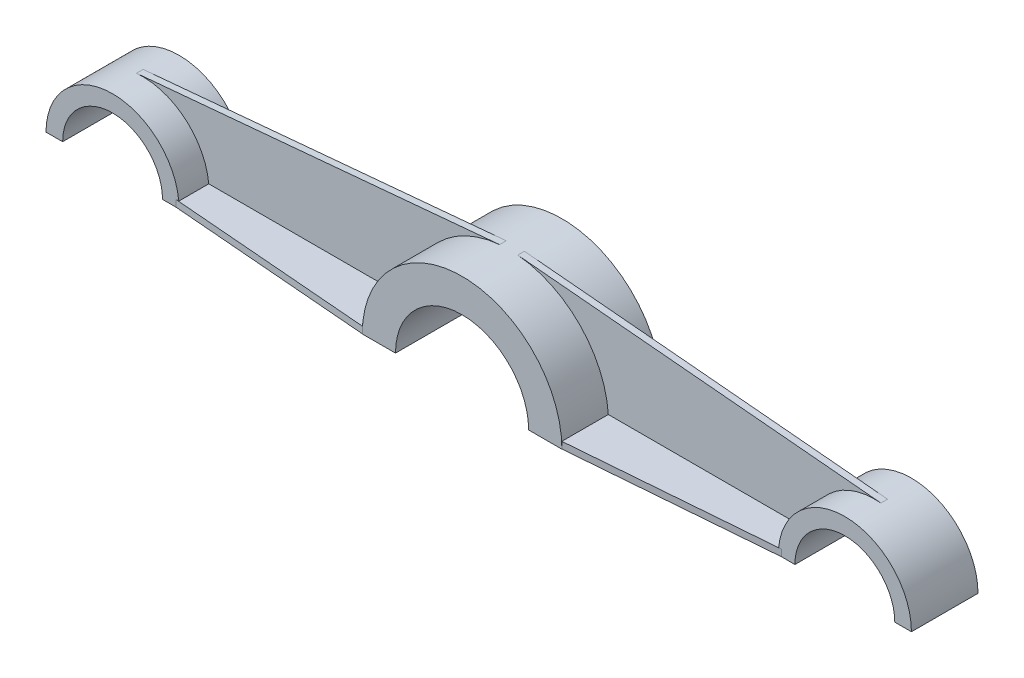
ISO-10303-21;
HEADER;
FILE_DESCRIPTION(('STEP AP214'),'2;1');
FILE_NAME('part.step','',(''),(''),'','','');
FILE_SCHEMA(('AUTOMOTIVE_DESIGN { 1 0 10303 214 1 1 1 1 }'));
ENDSEC;
DATA;
#1=APPLICATION_CONTEXT('core data for automotive mechanical design processes');
#2=APPLICATION_PROTOCOL_DEFINITION('international standard','automotive_design',2000,#1);
#3=PRODUCT_CONTEXT('',#1,'mechanical');
#4=PRODUCT('Part','Part','',(#3));
#5=PRODUCT_RELATED_PRODUCT_CATEGORY('part','',(#4));
#6=PRODUCT_DEFINITION_FORMATION('','',#4);
#7=PRODUCT_DEFINITION_CONTEXT('part definition',#1,'design');
#8=PRODUCT_DEFINITION('design','',#6,#7);
#9=PRODUCT_DEFINITION_SHAPE('','',#8);
#10=(LENGTH_UNIT() NAMED_UNIT(*) SI_UNIT(.MILLI.,.METRE.));
#11=(NAMED_UNIT(*) PLANE_ANGLE_UNIT() SI_UNIT($,.RADIAN.));
#12=(NAMED_UNIT(*) SI_UNIT($,.STERADIAN.) SOLID_ANGLE_UNIT());
#13=UNCERTAINTY_MEASURE_WITH_UNIT(LENGTH_MEASURE(1.E-05),#10,'distance_accuracy_value','');
#14=(GEOMETRIC_REPRESENTATION_CONTEXT(3) GLOBAL_UNCERTAINTY_ASSIGNED_CONTEXT((#13)) GLOBAL_UNIT_ASSIGNED_CONTEXT((#10,
#11,#12)) REPRESENTATION_CONTEXT('',''));
#15=CARTESIAN_POINT('',(0.,0.,0.));
#16=DIRECTION('',(0.,0.,1.));
#17=DIRECTION('',(1.,0.,0.));
#18=AXIS2_PLACEMENT_3D('',#15,#16,#17);
#19=CARTESIAN_POINT('',(0.,0.,15.));
#20=DIRECTION('',(0.,0.,-1.));
#21=DIRECTION('',(-1.,0.,0.));
#22=AXIS2_PLACEMENT_3D('',#19,#20,#21);
#23=CYLINDRICAL_SURFACE('',#22,30.);
#24=CARTESIAN_POINT('',(0.,0.,-17.3983739837398));
#25=DIRECTION('',(-0.0810334457587638,0.,0.996711382832794));
#26=DIRECTION('',(-0.996711382832794,0.,-0.0810334457587638));
#27=AXIS2_PLACEMENT_3D('',#24,#25,#26);
#28=ELLIPSE('',#27,30.098984035615,30.);
#29=CARTESIAN_POINT('',(30.,0.,-14.9593495934959));
#30=VERTEX_POINT('',#29);
#31=CARTESIAN_POINT('',(29.9332590941915,2.,-14.9647756833991));
#32=VERTEX_POINT('',#31);
#33=EDGE_CURVE('E245',#30,#32,#28,.T.);
#34=ORIENTED_EDGE('',*,*,#33,.F.);
#35=DIRECTION('',(0.,0.,-1.));
#36=VECTOR('',#35,1.);
#37=CARTESIAN_POINT('',(30.,0.,15.));
#38=LINE('',#37,#36);
#39=CARTESIAN_POINT('',(30.,0.,-15.));
#40=VERTEX_POINT('',#39);
#41=EDGE_CURVE('E502',#30,#40,#38,.T.);
#42=ORIENTED_EDGE('',*,*,#41,.T.);
#43=CARTESIAN_POINT('',(0.,0.,-15.));
#44=DIRECTION('',(0.,0.,1.));
#45=DIRECTION('',(1.,0.,0.));
#46=AXIS2_PLACEMENT_3D('',#43,#44,#45);
#47=CIRCLE('',#46,30.);
#48=CARTESIAN_POINT('',(-30.,0.,-15.));
#49=VERTEX_POINT('',#48);
#50=EDGE_CURVE('E481',#40,#49,#47,.T.);
#51=ORIENTED_EDGE('',*,*,#50,.T.);
#52=DIRECTION('',(0.,0.,-1.));
#53=VECTOR('',#52,1.);
#54=CARTESIAN_POINT('',(-30.,0.,15.));
#55=LINE('',#54,#53);
#56=CARTESIAN_POINT('',(-30.,0.,-14.9593495934959));
#57=VERTEX_POINT('',#56);
#58=EDGE_CURVE('E497',#57,#49,#55,.T.);
#59=ORIENTED_EDGE('',*,*,#58,.F.);
#60=CARTESIAN_POINT('',(0.,0.,-17.3983739837398));
#61=DIRECTION('',(0.0810334457587638,0.,0.996711382832794));
#62=DIRECTION('',(0.996711382832794,0.,-0.0810334457587638));
#63=AXIS2_PLACEMENT_3D('',#60,#61,#62);
#64=ELLIPSE('',#63,30.098984035615,30.);
#65=CARTESIAN_POINT('',(-29.9332590941915,2.,-14.9647756833991));
#66=VERTEX_POINT('',#65);
#67=EDGE_CURVE('E304',#66,#57,#64,.T.);
#68=ORIENTED_EDGE('',*,*,#67,.F.);
#69=DIRECTION('',(0.,0.,-1.));
#70=VECTOR('',#69,1.);
#71=CARTESIAN_POINT('',(-29.9332590941915,2.,15.));
#72=LINE('',#71,#70);
#73=CARTESIAN_POINT('',(-29.9332590941915,2.,-1.));
#74=VERTEX_POINT('',#73);
#75=EDGE_CURVE('E295',#74,#66,#72,.T.);
#76=ORIENTED_EDGE('',*,*,#75,.F.);
#77=CARTESIAN_POINT('',(0.,0.,-1.));
#78=DIRECTION('',(0.,0.,-1.));
#79=DIRECTION('',(1.,0.,0.));
#80=AXIS2_PLACEMENT_3D('',#77,#78,#79);
#81=CIRCLE('',#80,30.);
#82=CARTESIAN_POINT('',(-2.72727272727273,29.8757758639182,-1.));
#83=VERTEX_POINT('',#82);
#84=EDGE_CURVE('E385',#74,#83,#81,.T.);
#85=ORIENTED_EDGE('',*,*,#84,.T.);
#86=DIRECTION('',(0.,0.,-1.));
#87=VECTOR('',#86,1.);
#88=CARTESIAN_POINT('',(-2.72727272727273,29.8757758639182,1.));
#89=LINE('',#88,#87);
#90=CARTESIAN_POINT('',(-2.72727272727273,29.8757758639182,1.));
#91=VERTEX_POINT('',#90);
#92=EDGE_CURVE('E368',#91,#83,#89,.T.);
#93=ORIENTED_EDGE('',*,*,#92,.F.);
#94=CARTESIAN_POINT('',(0.,0.,1.));
#95=DIRECTION('',(0.,0.,-1.));
#96=DIRECTION('',(1.,0.,0.));
#97=AXIS2_PLACEMENT_3D('',#94,#95,#96);
#98=CIRCLE('',#97,30.);
#99=CARTESIAN_POINT('',(-29.9332590941915,2.,1.));
#100=VERTEX_POINT('',#99);
#101=EDGE_CURVE('E382',#100,#91,#98,.T.);
#102=ORIENTED_EDGE('',*,*,#101,.F.);
#103=CARTESIAN_POINT('',(-29.9332590941915,2.,14.9647756833991));
#104=VERTEX_POINT('',#103);
#105=EDGE_CURVE('E68',#104,#100,#72,.T.);
#106=ORIENTED_EDGE('',*,*,#105,.F.);
#107=CARTESIAN_POINT('',(0.,0.,17.3983739837398));
#108=DIRECTION('',(0.0810334457587638,0.,-0.996711382832794));
#109=DIRECTION('',(-0.996711382832794,0.,-0.0810334457587638));
#110=AXIS2_PLACEMENT_3D('',#107,#108,#109);
#111=ELLIPSE('',#110,30.098984035615,30.);
#112=CARTESIAN_POINT('',(-30.,0.,14.9593495934959));
#113=VERTEX_POINT('',#112);
#114=EDGE_CURVE('E307',#113,#104,#111,.T.);
#115=ORIENTED_EDGE('',*,*,#114,.F.);
#116=CARTESIAN_POINT('',(-30.,0.,15.));
#117=VERTEX_POINT('',#116);
#118=EDGE_CURVE('E498',#117,#113,#55,.T.);
#119=ORIENTED_EDGE('',*,*,#118,.F.);
#120=CARTESIAN_POINT('',(0.,0.,15.));
#121=DIRECTION('',(0.,0.,1.));
#122=DIRECTION('',(1.,0.,0.));
#123=AXIS2_PLACEMENT_3D('',#120,#121,#122);
#124=CIRCLE('',#123,30.);
#125=CARTESIAN_POINT('',(30.,0.,15.));
#126=VERTEX_POINT('',#125);
#127=EDGE_CURVE('E467',#126,#117,#124,.T.);
#128=ORIENTED_EDGE('',*,*,#127,.F.);
#129=CARTESIAN_POINT('',(30.,0.,14.9593495934959));
#130=VERTEX_POINT('',#129);
#131=EDGE_CURVE('E503',#126,#130,#38,.T.);
#132=ORIENTED_EDGE('',*,*,#131,.T.);
#133=CARTESIAN_POINT('',(0.,0.,17.3983739837398));
#134=DIRECTION('',(-0.0810334457587638,0.,-0.996711382832794));
#135=DIRECTION('',(0.996711382832794,0.,-0.0810334457587638));
#136=AXIS2_PLACEMENT_3D('',#133,#134,#135);
#137=ELLIPSE('',#136,30.098984035615,30.);
#138=CARTESIAN_POINT('',(29.9332590941915,2.,14.9647756833991));
#139=VERTEX_POINT('',#138);
#140=EDGE_CURVE('E61',#139,#130,#137,.T.);
#141=ORIENTED_EDGE('',*,*,#140,.F.);
#142=DIRECTION('',(0.,0.,-1.));
#143=VECTOR('',#142,1.);
#144=CARTESIAN_POINT('',(29.9332590941915,2.,15.));
#145=LINE('',#144,#143);
#146=CARTESIAN_POINT('',(29.9332590941915,2.,1.));
#147=VERTEX_POINT('',#146);
#148=EDGE_CURVE('E320',#147,#139,#145,.F.);
#149=ORIENTED_EDGE('',*,*,#148,.F.);
#150=CARTESIAN_POINT('',(0.,0.,1.));
#151=DIRECTION('',(0.,0.,-1.));
#152=DIRECTION('',(1.,0.,0.));
#153=AXIS2_PLACEMENT_3D('',#150,#151,#152);
#154=CIRCLE('',#153,30.);
#155=CARTESIAN_POINT('',(2.72727272727272,29.8757758639181,1.));
#156=VERTEX_POINT('',#155);
#157=EDGE_CURVE('E443',#156,#147,#154,.T.);
#158=ORIENTED_EDGE('',*,*,#157,.F.);
#159=DIRECTION('',(0.,0.,-1.));
#160=VECTOR('',#159,1.);
#161=CARTESIAN_POINT('',(2.72727272727273,29.8757758639181,1.));
#162=LINE('',#161,#160);
#163=CARTESIAN_POINT('',(2.72727272727273,29.8757758639181,-1.));
#164=VERTEX_POINT('',#163);
#165=EDGE_CURVE('E447',#156,#164,#162,.T.);
#166=ORIENTED_EDGE('',*,*,#165,.T.);
#167=CARTESIAN_POINT('',(0.,0.,-1.));
#168=DIRECTION('',(0.,0.,-1.));
#169=DIRECTION('',(1.,0.,0.));
#170=AXIS2_PLACEMENT_3D('',#167,#168,#169);
#171=CIRCLE('',#170,30.);
#172=CARTESIAN_POINT('',(29.9332590941915,2.,-1.));
#173=VERTEX_POINT('',#172);
#174=EDGE_CURVE('E439',#164,#173,#171,.T.);
#175=ORIENTED_EDGE('',*,*,#174,.T.);
#176=EDGE_CURVE('E316',#32,#173,#145,.F.);
#177=ORIENTED_EDGE('',*,*,#176,.F.);
#178=EDGE_LOOP('',(#34,#42,#51,#59,#68,#76,#85,#93,#102,#106,#115,#119,#128,#132,#141,#149,#158,
#166,#175,#177));
#179=FACE_BOUND('',#178,.T.);
#180=ADVANCED_FACE('F45',(#179),#23,.T.);
#181=CARTESIAN_POINT('',(110.,0.,1.));
#182=DIRECTION('',(0.,0.,1.));
#183=DIRECTION('',(1.,0.,0.));
#184=AXIS2_PLACEMENT_3D('',#181,#182,#183);
#185=PLANE('',#184);
#186=ORIENTED_EDGE('',*,*,#157,.T.);
#187=DIRECTION('',(1.,0.,0.));
#188=VECTOR('',#187,1.);
#189=CARTESIAN_POINT('',(110.,2.,1.));
#190=LINE('',#189,#188);
#191=CARTESIAN_POINT('',(90.1002512578676,2.,1.));
#192=VERTEX_POINT('',#191);
#193=EDGE_CURVE('E323',#147,#192,#190,.T.);
#194=ORIENTED_EDGE('',*,*,#193,.T.);
#195=CARTESIAN_POINT('',(110.,0.,1.));
#196=DIRECTION('',(0.,0.,-1.));
#197=DIRECTION('',(1.,0.,0.));
#198=AXIS2_PLACEMENT_3D('',#195,#196,#197);
#199=CIRCLE('',#198,20.);
#200=CARTESIAN_POINT('',(111.818181818182,19.9171839092788,1.));
#201=VERTEX_POINT('',#200);
#202=EDGE_CURVE('E435',#192,#201,#199,.T.);
#203=ORIENTED_EDGE('',*,*,#202,.T.);
#204=DIRECTION('',(-0.995859195463939,0.0909090909090908,0.));
#205=VECTOR('',#204,1.);
#206=CARTESIAN_POINT('',(2.72727272727272,29.8757758639181,1.));
#207=LINE('',#206,#205);
#208=EDGE_CURVE('E438',#201,#156,#207,.T.);
#209=ORIENTED_EDGE('',*,*,#208,.T.);
#210=EDGE_LOOP('',(#186,#194,#203,#209));
#211=FACE_BOUND('',#210,.T.);
#212=ADVANCED_FACE('F586',(#211),#185,.T.);
#213=CARTESIAN_POINT('',(110.,0.,-1.));
#214=DIRECTION('',(0.,0.,1.));
#215=DIRECTION('',(1.,0.,0.));
#216=AXIS2_PLACEMENT_3D('',#213,#214,#215);
#217=PLANE('',#216);
#218=DIRECTION('',(1.,0.,0.));
#219=VECTOR('',#218,1.);
#220=CARTESIAN_POINT('',(110.,2.,-1.));
#221=LINE('',#220,#219);
#222=CARTESIAN_POINT('',(90.1002512578676,2.,-0.999999999999999));
#223=VERTEX_POINT('',#222);
#224=EDGE_CURVE('E312',#173,#223,#221,.T.);
#225=ORIENTED_EDGE('',*,*,#224,.F.);
#226=ORIENTED_EDGE('',*,*,#174,.F.);
#227=DIRECTION('',(-0.995859195463939,0.0909090909090908,0.));
#228=VECTOR('',#227,1.);
#229=CARTESIAN_POINT('',(2.72727272727272,29.8757758639181,-1.));
#230=LINE('',#229,#228);
#231=CARTESIAN_POINT('',(111.818181818182,19.9171839092788,-0.999999999999999));
#232=VERTEX_POINT('',#231);
#233=EDGE_CURVE('E450',#232,#164,#230,.T.);
#234=ORIENTED_EDGE('',*,*,#233,.F.);
#235=CARTESIAN_POINT('',(110.,0.,-1.));
#236=DIRECTION('',(0.,0.,-1.));
#237=DIRECTION('',(1.,0.,0.));
#238=AXIS2_PLACEMENT_3D('',#235,#236,#237);
#239=CIRCLE('',#238,20.);
#240=EDGE_CURVE('E421',#223,#232,#239,.T.);
#241=ORIENTED_EDGE('',*,*,#240,.F.);
#242=EDGE_LOOP('',(#225,#226,#234,#241));
#243=FACE_BOUND('',#242,.T.);
#244=ADVANCED_FACE('F590',(#243),#217,.F.);
#245=CARTESIAN_POINT('',(110.,0.,10.));
#246=DIRECTION('',(0.,0.,-1.));
#247=DIRECTION('',(-1.,0.,0.));
#248=AXIS2_PLACEMENT_3D('',#245,#246,#247);
#249=CYLINDRICAL_SURFACE('',#248,20.);
#250=DIRECTION('',(0.,0.,-1.));
#251=VECTOR('',#250,1.);
#252=CARTESIAN_POINT('',(90.1002512578676,2.,10.));
#253=LINE('',#252,#251);
#254=CARTESIAN_POINT('',(90.1002512578676,2.,10.));
#255=VERTEX_POINT('',#254);
#256=EDGE_CURVE('E313',#255,#192,#253,.T.);
#257=ORIENTED_EDGE('',*,*,#256,.F.);
#258=CARTESIAN_POINT('',(110.,0.,10.));
#259=DIRECTION('',(0.,0.,1.));
#260=DIRECTION('',(1.,0.,0.));
#261=AXIS2_PLACEMENT_3D('',#258,#259,#260);
#262=CIRCLE('',#261,20.);
#263=CARTESIAN_POINT('',(130.,0.,10.));
#264=VERTEX_POINT('',#263);
#265=EDGE_CURVE('E428',#264,#255,#262,.T.);
#266=ORIENTED_EDGE('',*,*,#265,.F.);
#267=DIRECTION('',(0.,0.,-1.));
#268=VECTOR('',#267,1.);
#269=CARTESIAN_POINT('',(130.,0.,10.));
#270=LINE('',#269,#268);
#271=CARTESIAN_POINT('',(130.,0.,-10.));
#272=VERTEX_POINT('',#271);
#273=EDGE_CURVE('E388',#264,#272,#270,.T.);
#274=ORIENTED_EDGE('',*,*,#273,.T.);
#275=CARTESIAN_POINT('',(110.,0.,-10.));
#276=DIRECTION('',(0.,0.,1.));
#277=DIRECTION('',(1.,0.,0.));
#278=AXIS2_PLACEMENT_3D('',#275,#276,#277);
#279=CIRCLE('',#278,20.);
#280=CARTESIAN_POINT('',(90.1002512578676,2.,-10.));
#281=VERTEX_POINT('',#280);
#282=EDGE_CURVE('E414',#272,#281,#279,.T.);
#283=ORIENTED_EDGE('',*,*,#282,.T.);
#284=EDGE_CURVE('E235',#223,#281,#253,.T.);
#285=ORIENTED_EDGE('',*,*,#284,.F.);
#286=ORIENTED_EDGE('',*,*,#240,.T.);
#287=DIRECTION('',(0.,0.,-1.));
#288=VECTOR('',#287,1.);
#289=CARTESIAN_POINT('',(111.818181818182,19.9171839092788,1.));
#290=LINE('',#289,#288);
#291=EDGE_CURVE('E459',#201,#232,#290,.T.);
#292=ORIENTED_EDGE('',*,*,#291,.F.);
#293=ORIENTED_EDGE('',*,*,#202,.F.);
#294=EDGE_LOOP('',(#257,#266,#274,#283,#285,#286,#292,#293));
#295=FACE_BOUND('',#294,.T.);
#296=ADVANCED_FACE('F608',(#295),#249,.T.);
#297=CARTESIAN_POINT('',(110.,0.,10.));
#298=DIRECTION('',(0.,0.,1.));
#299=DIRECTION('',(1.,0.,0.));
#300=AXIS2_PLACEMENT_3D('',#297,#298,#299);
#301=PLANE('',#300);
#302=DIRECTION('',(1.,0.,0.));
#303=VECTOR('',#302,1.);
#304=CARTESIAN_POINT('',(110.,2.,10.));
#305=LINE('',#304,#303);
#306=CARTESIAN_POINT('',(91.,2.,10.));
#307=VERTEX_POINT('',#306);
#308=EDGE_CURVE('E319',#255,#307,#305,.T.);
#309=ORIENTED_EDGE('',*,*,#308,.T.);
#310=DIRECTION('',(0.,-1.,0.));
#311=VECTOR('',#310,1.);
#312=CARTESIAN_POINT('',(91.,2.,10.));
#313=LINE('',#312,#311);
#314=CARTESIAN_POINT('',(91.,0.,10.));
#315=VERTEX_POINT('',#314);
#316=EDGE_CURVE('E254',#307,#315,#313,.T.);
#317=ORIENTED_EDGE('',*,*,#316,.T.);
#318=DIRECTION('',(1.,0.,0.));
#319=VECTOR('',#318,1.);
#320=CARTESIAN_POINT('',(90.,0.,10.));
#321=LINE('',#320,#319);
#322=CARTESIAN_POINT('',(95.,0.,10.));
#323=VERTEX_POINT('',#322);
#324=EDGE_CURVE('E425',#315,#323,#321,.T.);
#325=ORIENTED_EDGE('',*,*,#324,.T.);
#326=CARTESIAN_POINT('',(110.,0.,10.));
#327=DIRECTION('',(0.,0.,1.));
#328=DIRECTION('',(1.,0.,0.));
#329=AXIS2_PLACEMENT_3D('',#326,#327,#328);
#330=CIRCLE('',#329,15.);
#331=CARTESIAN_POINT('',(125.,0.,10.));
#332=VERTEX_POINT('',#331);
#333=EDGE_CURVE('E407',#332,#323,#330,.T.);
#334=ORIENTED_EDGE('',*,*,#333,.F.);
#335=DIRECTION('',(1.,0.,0.));
#336=VECTOR('',#335,1.);
#337=CARTESIAN_POINT('',(125.,0.,10.));
#338=LINE('',#337,#336);
#339=EDGE_CURVE('E411',#332,#264,#338,.T.);
#340=ORIENTED_EDGE('',*,*,#339,.T.);
#341=ORIENTED_EDGE('',*,*,#265,.T.);
#342=EDGE_LOOP('',(#309,#317,#325,#334,#340,#341));
#343=FACE_BOUND('',#342,.T.);
#344=ADVANCED_FACE('F611',(#343),#301,.T.);
#345=CARTESIAN_POINT('',(110.,0.,-10.));
#346=DIRECTION('',(0.,0.,1.));
#347=DIRECTION('',(1.,0.,0.));
#348=AXIS2_PLACEMENT_3D('',#345,#346,#347);
#349=PLANE('',#348);
#350=DIRECTION('',(0.,-1.,0.));
#351=VECTOR('',#350,1.);
#352=CARTESIAN_POINT('',(91.,2.,-10.));
#353=LINE('',#352,#351);
#354=CARTESIAN_POINT('',(91.,2.,-10.));
#355=VERTEX_POINT('',#354);
#356=CARTESIAN_POINT('',(91.,0.,-10.));
#357=VERTEX_POINT('',#356);
#358=EDGE_CURVE('E242',#355,#357,#353,.T.);
#359=ORIENTED_EDGE('',*,*,#358,.F.);
#360=DIRECTION('',(1.,0.,0.));
#361=VECTOR('',#360,1.);
#362=CARTESIAN_POINT('',(110.,2.,-10.));
#363=LINE('',#362,#361);
#364=EDGE_CURVE('E11',#281,#355,#363,.T.);
#365=ORIENTED_EDGE('',*,*,#364,.F.);
#366=ORIENTED_EDGE('',*,*,#282,.F.);
#367=DIRECTION('',(1.,0.,0.));
#368=VECTOR('',#367,1.);
#369=CARTESIAN_POINT('',(125.,0.,-10.));
#370=LINE('',#369,#368);
#371=CARTESIAN_POINT('',(125.,0.,-10.));
#372=VERTEX_POINT('',#371);
#373=EDGE_CURVE('E417',#372,#272,#370,.T.);
#374=ORIENTED_EDGE('',*,*,#373,.F.);
#375=CARTESIAN_POINT('',(110.,0.,-10.));
#376=DIRECTION('',(0.,0.,1.));
#377=DIRECTION('',(1.,0.,0.));
#378=AXIS2_PLACEMENT_3D('',#375,#376,#377);
#379=CIRCLE('',#378,15.);
#380=CARTESIAN_POINT('',(95.,0.,-10.));
#381=VERTEX_POINT('',#380);
#382=EDGE_CURVE('E408',#372,#381,#379,.T.);
#383=ORIENTED_EDGE('',*,*,#382,.T.);
#384=DIRECTION('',(1.,0.,0.));
#385=VECTOR('',#384,1.);
#386=CARTESIAN_POINT('',(90.,0.,-10.));
#387=LINE('',#386,#385);
#388=EDGE_CURVE('E252',#357,#381,#387,.T.);
#389=ORIENTED_EDGE('',*,*,#388,.F.);
#390=EDGE_LOOP('',(#359,#365,#366,#374,#383,#389));
#391=FACE_BOUND('',#390,.T.);
#392=ADVANCED_FACE('F250',(#391),#349,.F.);
#393=CARTESIAN_POINT('',(0.,0.,1.));
#394=DIRECTION('',(0.,0.,1.));
#395=DIRECTION('',(1.,0.,0.));
#396=AXIS2_PLACEMENT_3D('',#393,#394,#395);
#397=PLANE('',#396);
#398=CARTESIAN_POINT('',(-110.,0.,1.));
#399=DIRECTION('',(0.,0.,-1.));
#400=DIRECTION('',(1.,0.,0.));
#401=AXIS2_PLACEMENT_3D('',#398,#399,#400);
#402=CIRCLE('',#401,20.);
#403=CARTESIAN_POINT('',(-111.818181818182,19.9171839092788,1.));
#404=VERTEX_POINT('',#403);
#405=CARTESIAN_POINT('',(-90.1002512578676,2.,1.));
#406=VERTEX_POINT('',#405);
#407=EDGE_CURVE('E376',#404,#406,#402,.T.);
#408=ORIENTED_EDGE('',*,*,#407,.T.);
#409=DIRECTION('',(1.,0.,0.));
#410=VECTOR('',#409,1.);
#411=CARTESIAN_POINT('',(0.,2.,1.));
#412=LINE('',#411,#410);
#413=EDGE_CURVE('E301',#406,#100,#412,.T.);
#414=ORIENTED_EDGE('',*,*,#413,.T.);
#415=ORIENTED_EDGE('',*,*,#101,.T.);
#416=DIRECTION('',(-0.995859195463939,-0.0909090909090909,0.));
#417=VECTOR('',#416,1.);
#418=CARTESIAN_POINT('',(-111.818181818182,19.9171839092788,1.));
#419=LINE('',#418,#417);
#420=EDGE_CURVE('E392',#91,#404,#419,.T.);
#421=ORIENTED_EDGE('',*,*,#420,.T.);
#422=EDGE_LOOP('',(#408,#414,#415,#421));
#423=FACE_BOUND('',#422,.T.);
#424=ADVANCED_FACE('F617',(#423),#397,.T.);
#425=CARTESIAN_POINT('',(0.,0.,-1.));
#426=DIRECTION('',(0.,0.,1.));
#427=DIRECTION('',(1.,0.,0.));
#428=AXIS2_PLACEMENT_3D('',#425,#426,#427);
#429=PLANE('',#428);
#430=DIRECTION('',(1.,0.,0.));
#431=VECTOR('',#430,1.);
#432=CARTESIAN_POINT('',(0.,2.,-1.));
#433=LINE('',#432,#431);
#434=CARTESIAN_POINT('',(-90.1002512578676,2.,-0.999999999999999));
#435=VERTEX_POINT('',#434);
#436=EDGE_CURVE('E291',#435,#74,#433,.T.);
#437=ORIENTED_EDGE('',*,*,#436,.F.);
#438=CARTESIAN_POINT('',(-110.,0.,-1.));
#439=DIRECTION('',(0.,0.,-1.));
#440=DIRECTION('',(1.,0.,0.));
#441=AXIS2_PLACEMENT_3D('',#438,#439,#440);
#442=CIRCLE('',#441,20.);
#443=CARTESIAN_POINT('',(-111.818181818182,19.9171839092788,-1.));
#444=VERTEX_POINT('',#443);
#445=EDGE_CURVE('E377',#444,#435,#442,.T.);
#446=ORIENTED_EDGE('',*,*,#445,.F.);
#447=DIRECTION('',(-0.995859195463939,-0.0909090909090909,0.));
#448=VECTOR('',#447,1.);
#449=CARTESIAN_POINT('',(-111.818181818182,19.9171839092788,-1.));
#450=LINE('',#449,#448);
#451=EDGE_CURVE('E381',#83,#444,#450,.T.);
#452=ORIENTED_EDGE('',*,*,#451,.F.);
#453=ORIENTED_EDGE('',*,*,#84,.F.);
#454=EDGE_LOOP('',(#437,#446,#452,#453));
#455=FACE_BOUND('',#454,.T.);
#456=ADVANCED_FACE('F630',(#455),#429,.F.);
#457=CARTESIAN_POINT('',(-110.,0.,10.));
#458=DIRECTION('',(0.,0.,-1.));
#459=DIRECTION('',(-1.,0.,0.));
#460=AXIS2_PLACEMENT_3D('',#457,#458,#459);
#461=CYLINDRICAL_SURFACE('',#460,20.);
#462=DIRECTION('',(0.,0.,-1.));
#463=VECTOR('',#462,1.);
#464=CARTESIAN_POINT('',(-90.1002512578676,2.,10.));
#465=LINE('',#464,#463);
#466=CARTESIAN_POINT('',(-90.1002512578676,2.,-10.));
#467=VERTEX_POINT('',#466);
#468=EDGE_CURVE('E259',#467,#435,#465,.F.);
#469=ORIENTED_EDGE('',*,*,#468,.F.);
#470=CARTESIAN_POINT('',(-110.,0.,-10.));
#471=DIRECTION('',(0.,0.,1.));
#472=DIRECTION('',(1.,0.,0.));
#473=AXIS2_PLACEMENT_3D('',#470,#471,#472);
#474=CIRCLE('',#473,20.);
#475=CARTESIAN_POINT('',(-130.,0.,-10.));
#476=VERTEX_POINT('',#475);
#477=EDGE_CURVE('E349',#467,#476,#474,.T.);
#478=ORIENTED_EDGE('',*,*,#477,.T.);
#479=DIRECTION('',(0.,0.,-1.));
#480=VECTOR('',#479,1.);
#481=CARTESIAN_POINT('',(-130.,0.,10.));
#482=LINE('',#481,#480);
#483=CARTESIAN_POINT('',(-130.,0.,10.));
#484=VERTEX_POINT('',#483);
#485=EDGE_CURVE('E364',#484,#476,#482,.T.);
#486=ORIENTED_EDGE('',*,*,#485,.F.);
#487=CARTESIAN_POINT('',(-110.,0.,10.));
#488=DIRECTION('',(0.,0.,1.));
#489=DIRECTION('',(1.,0.,0.));
#490=AXIS2_PLACEMENT_3D('',#487,#488,#489);
#491=CIRCLE('',#490,20.);
#492=CARTESIAN_POINT('',(-90.1002512578676,2.,10.));
#493=VERTEX_POINT('',#492);
#494=EDGE_CURVE('E334',#493,#484,#491,.T.);
#495=ORIENTED_EDGE('',*,*,#494,.F.);
#496=EDGE_CURVE('E292',#406,#493,#465,.F.);
#497=ORIENTED_EDGE('',*,*,#496,.F.);
#498=ORIENTED_EDGE('',*,*,#407,.F.);
#499=DIRECTION('',(0.,0.,-1.));
#500=VECTOR('',#499,1.);
#501=CARTESIAN_POINT('',(-111.818181818182,19.9171839092788,1.));
#502=LINE('',#501,#500);
#503=EDGE_CURVE('E372',#404,#444,#502,.T.);
#504=ORIENTED_EDGE('',*,*,#503,.T.);
#505=ORIENTED_EDGE('',*,*,#445,.T.);
#506=EDGE_LOOP('',(#469,#478,#486,#495,#497,#498,#504,#505));
#507=FACE_BOUND('',#506,.T.);
#508=ADVANCED_FACE('F516',(#507),#461,.T.);
#509=CARTESIAN_POINT('',(-110.,0.,10.));
#510=DIRECTION('',(0.,0.,1.));
#511=DIRECTION('',(1.,0.,0.));
#512=AXIS2_PLACEMENT_3D('',#509,#510,#511);
#513=PLANE('',#512);
#514=DIRECTION('',(1.,0.,0.));
#515=VECTOR('',#514,1.);
#516=CARTESIAN_POINT('',(-95.,0.,10.));
#517=LINE('',#516,#515);
#518=CARTESIAN_POINT('',(-95.,0.,10.));
#519=VERTEX_POINT('',#518);
#520=CARTESIAN_POINT('',(-91.,0.,10.));
#521=VERTEX_POINT('',#520);
#522=EDGE_CURVE('E331',#519,#521,#517,.T.);
#523=ORIENTED_EDGE('',*,*,#522,.T.);
#524=DIRECTION('',(0.,-1.,0.));
#525=VECTOR('',#524,1.);
#526=CARTESIAN_POINT('',(-91.,2.,10.));
#527=LINE('',#526,#525);
#528=CARTESIAN_POINT('',(-91.,2.,10.));
#529=VERTEX_POINT('',#528);
#530=EDGE_CURVE('E270',#529,#521,#527,.T.);
#531=ORIENTED_EDGE('',*,*,#530,.F.);
#532=DIRECTION('',(1.,0.,0.));
#533=VECTOR('',#532,1.);
#534=CARTESIAN_POINT('',(-110.,2.,10.));
#535=LINE('',#534,#533);
#536=EDGE_CURVE('E298',#529,#493,#535,.T.);
#537=ORIENTED_EDGE('',*,*,#536,.T.);
#538=ORIENTED_EDGE('',*,*,#494,.T.);
#539=DIRECTION('',(1.,0.,0.));
#540=VECTOR('',#539,1.);
#541=CARTESIAN_POINT('',(-130.,0.,10.));
#542=LINE('',#541,#540);
#543=CARTESIAN_POINT('',(-125.,0.,10.));
#544=VERTEX_POINT('',#543);
#545=EDGE_CURVE('E338',#484,#544,#542,.T.);
#546=ORIENTED_EDGE('',*,*,#545,.T.);
#547=CARTESIAN_POINT('',(-110.,0.,10.));
#548=DIRECTION('',(0.,0.,1.));
#549=DIRECTION('',(1.,0.,0.));
#550=AXIS2_PLACEMENT_3D('',#547,#548,#549);
#551=CIRCLE('',#550,15.);
#552=EDGE_CURVE('E341',#519,#544,#551,.T.);
#553=ORIENTED_EDGE('',*,*,#552,.F.);
#554=EDGE_LOOP('',(#523,#531,#537,#538,#546,#553));
#555=FACE_BOUND('',#554,.T.);
#556=ADVANCED_FACE('F570',(#555),#513,.T.);
#557=CARTESIAN_POINT('',(-110.,0.,-10.));
#558=DIRECTION('',(0.,0.,1.));
#559=DIRECTION('',(1.,0.,0.));
#560=AXIS2_PLACEMENT_3D('',#557,#558,#559);
#561=PLANE('',#560);
#562=DIRECTION('',(0.,-1.,0.));
#563=VECTOR('',#562,1.);
#564=CARTESIAN_POINT('',(-91.,2.,-10.));
#565=LINE('',#564,#563);
#566=CARTESIAN_POINT('',(-91.,2.,-10.));
#567=VERTEX_POINT('',#566);
#568=CARTESIAN_POINT('',(-91.,0.,-10.));
#569=VERTEX_POINT('',#568);
#570=EDGE_CURVE('E266',#567,#569,#565,.T.);
#571=ORIENTED_EDGE('',*,*,#570,.T.);
#572=DIRECTION('',(1.,0.,0.));
#573=VECTOR('',#572,1.);
#574=CARTESIAN_POINT('',(-95.,0.,-10.));
#575=LINE('',#574,#573);
#576=CARTESIAN_POINT('',(-95.,0.,-10.));
#577=VERTEX_POINT('',#576);
#578=EDGE_CURVE('E330',#577,#569,#575,.T.);
#579=ORIENTED_EDGE('',*,*,#578,.F.);
#580=CARTESIAN_POINT('',(-110.,0.,-10.));
#581=DIRECTION('',(0.,0.,1.));
#582=DIRECTION('',(1.,0.,0.));
#583=AXIS2_PLACEMENT_3D('',#580,#581,#582);
#584=CIRCLE('',#583,15.);
#585=CARTESIAN_POINT('',(-125.,0.,-10.));
#586=VERTEX_POINT('',#585);
#587=EDGE_CURVE('E335',#577,#586,#584,.T.);
#588=ORIENTED_EDGE('',*,*,#587,.T.);
#589=DIRECTION('',(1.,0.,0.));
#590=VECTOR('',#589,1.);
#591=CARTESIAN_POINT('',(-130.,0.,-10.));
#592=LINE('',#591,#590);
#593=EDGE_CURVE('E352',#476,#586,#592,.T.);
#594=ORIENTED_EDGE('',*,*,#593,.F.);
#595=ORIENTED_EDGE('',*,*,#477,.F.);
#596=DIRECTION('',(1.,0.,0.));
#597=VECTOR('',#596,1.);
#598=CARTESIAN_POINT('',(-110.,2.,-10.));
#599=LINE('',#598,#597);
#600=EDGE_CURVE('E54',#567,#467,#599,.T.);
#601=ORIENTED_EDGE('',*,*,#600,.F.);
#602=EDGE_LOOP('',(#571,#579,#588,#594,#595,#601));
#603=FACE_BOUND('',#602,.T.);
#604=ADVANCED_FACE('F520',(#603),#561,.F.);
#605=CARTESIAN_POINT('',(20.,0.,15.));
#606=DIRECTION('',(0.,1.,0.));
#607=DIRECTION('',(0.,0.,1.));
#608=AXIS2_PLACEMENT_3D('',#605,#606,#607);
#609=PLANE('',#608);
#610=DIRECTION('',(1.,0.,0.));
#611=VECTOR('',#610,1.);
#612=CARTESIAN_POINT('',(20.,0.,-15.));
#613=LINE('',#612,#611);
#614=CARTESIAN_POINT('',(20.,0.,-15.));
#615=VERTEX_POINT('',#614);
#616=EDGE_CURVE('E463',#615,#40,#613,.T.);
#617=ORIENTED_EDGE('',*,*,#616,.T.);
#618=ORIENTED_EDGE('',*,*,#41,.F.);
#619=DIRECTION('',(-0.996711382832794,0.,-0.0810334457587638));
#620=VECTOR('',#619,1.);
#621=CARTESIAN_POINT('',(29.5,0.,-15.));
#622=LINE('',#621,#620);
#623=EDGE_CURVE('E283',#357,#30,#622,.T.);
#624=ORIENTED_EDGE('',*,*,#623,.F.);
#625=ORIENTED_EDGE('',*,*,#388,.T.);
#626=DIRECTION('',(0.,0.,-1.));
#627=VECTOR('',#626,1.);
#628=CARTESIAN_POINT('',(95.,0.,10.));
#629=LINE('',#628,#627);
#630=EDGE_CURVE('E400',#323,#381,#629,.T.);
#631=ORIENTED_EDGE('',*,*,#630,.F.);
#632=ORIENTED_EDGE('',*,*,#324,.F.);
#633=DIRECTION('',(0.996711382832794,0.,-0.0810334457587638));
#634=VECTOR('',#633,1.);
#635=CARTESIAN_POINT('',(29.5,0.,15.));
#636=LINE('',#635,#634);
#637=EDGE_CURVE('E248',#130,#315,#636,.T.);
#638=ORIENTED_EDGE('',*,*,#637,.F.);
#639=ORIENTED_EDGE('',*,*,#131,.F.);
#640=DIRECTION('',(1.,0.,0.));
#641=VECTOR('',#640,1.);
#642=CARTESIAN_POINT('',(20.,0.,15.));
#643=LINE('',#642,#641);
#644=CARTESIAN_POINT('',(20.,0.,15.));
#645=VERTEX_POINT('',#644);
#646=EDGE_CURVE('E464',#645,#126,#643,.T.);
#647=ORIENTED_EDGE('',*,*,#646,.F.);
#648=DIRECTION('',(0.,0.,-1.));
#649=VECTOR('',#648,1.);
#650=CARTESIAN_POINT('',(20.,0.,15.));
#651=LINE('',#650,#649);
#652=EDGE_CURVE('E478',#645,#615,#651,.T.);
#653=ORIENTED_EDGE('',*,*,#652,.T.);
#654=EDGE_LOOP('',(#617,#618,#624,#625,#631,#632,#638,#639,#647,#653));
#655=FACE_BOUND('',#654,.T.);
#656=ADVANCED_FACE('F47',(#655),#609,.F.);
#657=CARTESIAN_POINT('',(-30.,0.,15.));
#658=DIRECTION('',(0.,1.,0.));
#659=DIRECTION('',(0.,0.,1.));
#660=AXIS2_PLACEMENT_3D('',#657,#658,#659);
#661=PLANE('',#660);
#662=DIRECTION('',(-0.996711382832795,0.,0.0810334457587638));
#663=VECTOR('',#662,1.);
#664=CARTESIAN_POINT('',(-91.,0.,-10.));
#665=LINE('',#664,#663);
#666=EDGE_CURVE('E279',#57,#569,#665,.T.);
#667=ORIENTED_EDGE('',*,*,#666,.F.);
#668=ORIENTED_EDGE('',*,*,#58,.T.);
#669=DIRECTION('',(1.,0.,0.));
#670=VECTOR('',#669,1.);
#671=CARTESIAN_POINT('',(-30.,0.,-15.));
#672=LINE('',#671,#670);
#673=CARTESIAN_POINT('',(-20.,0.,-15.));
#674=VERTEX_POINT('',#673);
#675=EDGE_CURVE('E485',#49,#674,#672,.T.);
#676=ORIENTED_EDGE('',*,*,#675,.T.);
#677=DIRECTION('',(0.,0.,-1.));
#678=VECTOR('',#677,1.);
#679=CARTESIAN_POINT('',(-20.,0.,15.));
#680=LINE('',#679,#678);
#681=CARTESIAN_POINT('',(-20.,0.,15.));
#682=VERTEX_POINT('',#681);
#683=EDGE_CURVE('E493',#682,#674,#680,.T.);
#684=ORIENTED_EDGE('',*,*,#683,.F.);
#685=DIRECTION('',(1.,0.,0.));
#686=VECTOR('',#685,1.);
#687=CARTESIAN_POINT('',(-30.,0.,15.));
#688=LINE('',#687,#686);
#689=EDGE_CURVE('E471',#117,#682,#688,.T.);
#690=ORIENTED_EDGE('',*,*,#689,.F.);
#691=ORIENTED_EDGE('',*,*,#118,.T.);
#692=DIRECTION('',(0.996711382832795,0.,0.0810334457587638));
#693=VECTOR('',#692,1.);
#694=CARTESIAN_POINT('',(-91.,0.,10.));
#695=LINE('',#694,#693);
#696=EDGE_CURVE('E275',#521,#113,#695,.T.);
#697=ORIENTED_EDGE('',*,*,#696,.F.);
#698=ORIENTED_EDGE('',*,*,#522,.F.);
#699=DIRECTION('',(0.,0.,-1.));
#700=VECTOR('',#699,1.);
#701=CARTESIAN_POINT('',(-95.,0.,10.));
#702=LINE('',#701,#700);
#703=EDGE_CURVE('E345',#519,#577,#702,.T.);
#704=ORIENTED_EDGE('',*,*,#703,.T.);
#705=ORIENTED_EDGE('',*,*,#578,.T.);
#706=EDGE_LOOP('',(#667,#668,#676,#684,#690,#691,#697,#698,#704,#705));
#707=FACE_BOUND('',#706,.T.);
#708=ADVANCED_FACE('F556',(#707),#661,.F.);
#709=CARTESIAN_POINT('',(0.,0.,15.));
#710=DIRECTION('',(0.,0.,-1.));
#711=DIRECTION('',(-1.,0.,0.));
#712=AXIS2_PLACEMENT_3D('',#709,#710,#711);
#713=CYLINDRICAL_SURFACE('',#712,20.);
#714=CARTESIAN_POINT('',(0.,0.,-15.));
#715=DIRECTION('',(0.,0.,1.));
#716=DIRECTION('',(1.,0.,0.));
#717=AXIS2_PLACEMENT_3D('',#714,#715,#716);
#718=CIRCLE('',#717,20.);
#719=EDGE_CURVE('E468',#615,#674,#718,.T.);
#720=ORIENTED_EDGE('',*,*,#719,.F.);
#721=ORIENTED_EDGE('',*,*,#652,.F.);
#722=CARTESIAN_POINT('',(0.,0.,15.));
#723=DIRECTION('',(0.,0.,1.));
#724=DIRECTION('',(1.,0.,0.));
#725=AXIS2_PLACEMENT_3D('',#722,#723,#724);
#726=CIRCLE('',#725,20.);
#727=EDGE_CURVE('E474',#645,#682,#726,.T.);
#728=ORIENTED_EDGE('',*,*,#727,.T.);
#729=ORIENTED_EDGE('',*,*,#683,.T.);
#730=EDGE_LOOP('',(#720,#721,#728,#729));
#731=FACE_BOUND('',#730,.T.);
#732=ADVANCED_FACE('F559',(#731),#713,.F.);
#733=CARTESIAN_POINT('',(0.,0.,15.));
#734=DIRECTION('',(0.,0.,1.));
#735=DIRECTION('',(1.,0.,0.));
#736=AXIS2_PLACEMENT_3D('',#733,#734,#735);
#737=PLANE('',#736);
#738=ORIENTED_EDGE('',*,*,#646,.T.);
#739=ORIENTED_EDGE('',*,*,#127,.T.);
#740=ORIENTED_EDGE('',*,*,#689,.T.);
#741=ORIENTED_EDGE('',*,*,#727,.F.);
#742=EDGE_LOOP('',(#738,#739,#740,#741));
#743=FACE_BOUND('',#742,.T.);
#744=ADVANCED_FACE('F563',(#743),#737,.T.);
#745=CARTESIAN_POINT('',(0.,0.,-15.));
#746=DIRECTION('',(0.,0.,1.));
#747=DIRECTION('',(1.,0.,0.));
#748=AXIS2_PLACEMENT_3D('',#745,#746,#747);
#749=PLANE('',#748);
#750=ORIENTED_EDGE('',*,*,#719,.T.);
#751=ORIENTED_EDGE('',*,*,#675,.F.);
#752=ORIENTED_EDGE('',*,*,#50,.F.);
#753=ORIENTED_EDGE('',*,*,#616,.F.);
#754=EDGE_LOOP('',(#750,#751,#752,#753));
#755=FACE_BOUND('',#754,.T.);
#756=ADVANCED_FACE('F551',(#755),#749,.F.);
#757=CARTESIAN_POINT('',(2.72727272727272,29.8757758639181,1.));
#758=DIRECTION('',(-0.0909090909090908,-0.995859195463938,0.));
#759=DIRECTION('',(0.995859195463938,-0.0909090909090908,0.));
#760=AXIS2_PLACEMENT_3D('',#757,#758,#759);
#761=PLANE('',#760);
#762=ORIENTED_EDGE('',*,*,#233,.T.);
#763=ORIENTED_EDGE('',*,*,#165,.F.);
#764=ORIENTED_EDGE('',*,*,#208,.F.);
#765=ORIENTED_EDGE('',*,*,#291,.T.);
#766=EDGE_LOOP('',(#762,#763,#764,#765));
#767=FACE_BOUND('',#766,.T.);
#768=ADVANCED_FACE('F600',(#767),#761,.F.);
#769=CARTESIAN_POINT('',(125.,0.,10.));
#770=DIRECTION('',(0.,1.,0.));
#771=DIRECTION('',(0.,0.,1.));
#772=AXIS2_PLACEMENT_3D('',#769,#770,#771);
#773=PLANE('',#772);
#774=ORIENTED_EDGE('',*,*,#373,.T.);
#775=ORIENTED_EDGE('',*,*,#273,.F.);
#776=ORIENTED_EDGE('',*,*,#339,.F.);
#777=DIRECTION('',(0.,0.,-1.));
#778=VECTOR('',#777,1.);
#779=CARTESIAN_POINT('',(125.,0.,10.));
#780=LINE('',#779,#778);
#781=EDGE_CURVE('E404',#332,#372,#780,.T.);
#782=ORIENTED_EDGE('',*,*,#781,.T.);
#783=EDGE_LOOP('',(#774,#775,#776,#782));
#784=FACE_BOUND('',#783,.T.);
#785=ADVANCED_FACE('F605',(#784),#773,.F.);
#786=CARTESIAN_POINT('',(110.,0.,10.));
#787=DIRECTION('',(0.,0.,-1.));
#788=DIRECTION('',(-1.,0.,0.));
#789=AXIS2_PLACEMENT_3D('',#786,#787,#788);
#790=CYLINDRICAL_SURFACE('',#789,15.);
#791=ORIENTED_EDGE('',*,*,#382,.F.);
#792=ORIENTED_EDGE('',*,*,#781,.F.);
#793=ORIENTED_EDGE('',*,*,#333,.T.);
#794=ORIENTED_EDGE('',*,*,#630,.T.);
#795=EDGE_LOOP('',(#791,#792,#793,#794));
#796=FACE_BOUND('',#795,.T.);
#797=ADVANCED_FACE('F618',(#796),#790,.F.);
#798=CARTESIAN_POINT('',(-111.818181818182,19.9171839092788,1.));
#799=DIRECTION('',(0.0909090909090909,-0.995859195463938,0.));
#800=DIRECTION('',(0.995859195463938,0.0909090909090909,0.));
#801=AXIS2_PLACEMENT_3D('',#798,#799,#800);
#802=PLANE('',#801);
#803=ORIENTED_EDGE('',*,*,#451,.T.);
#804=ORIENTED_EDGE('',*,*,#503,.F.);
#805=ORIENTED_EDGE('',*,*,#420,.F.);
#806=ORIENTED_EDGE('',*,*,#92,.T.);
#807=EDGE_LOOP('',(#803,#804,#805,#806));
#808=FACE_BOUND('',#807,.T.);
#809=ADVANCED_FACE('F583',(#808),#802,.F.);
#810=CARTESIAN_POINT('',(-130.,0.,10.));
#811=DIRECTION('',(0.,1.,0.));
#812=DIRECTION('',(0.,0.,1.));
#813=AXIS2_PLACEMENT_3D('',#810,#811,#812);
#814=PLANE('',#813);
#815=ORIENTED_EDGE('',*,*,#593,.T.);
#816=DIRECTION('',(0.,0.,-1.));
#817=VECTOR('',#816,1.);
#818=CARTESIAN_POINT('',(-125.,0.,10.));
#819=LINE('',#818,#817);
#820=EDGE_CURVE('E361',#544,#586,#819,.T.);
#821=ORIENTED_EDGE('',*,*,#820,.F.);
#822=ORIENTED_EDGE('',*,*,#545,.F.);
#823=ORIENTED_EDGE('',*,*,#485,.T.);
#824=EDGE_LOOP('',(#815,#821,#822,#823));
#825=FACE_BOUND('',#824,.T.);
#826=ADVANCED_FACE('F525',(#825),#814,.F.);
#827=CARTESIAN_POINT('',(-110.,0.,10.));
#828=DIRECTION('',(0.,0.,-1.));
#829=DIRECTION('',(-1.,0.,0.));
#830=AXIS2_PLACEMENT_3D('',#827,#828,#829);
#831=CYLINDRICAL_SURFACE('',#830,15.);
#832=ORIENTED_EDGE('',*,*,#587,.F.);
#833=ORIENTED_EDGE('',*,*,#703,.F.);
#834=ORIENTED_EDGE('',*,*,#552,.T.);
#835=ORIENTED_EDGE('',*,*,#820,.T.);
#836=EDGE_LOOP('',(#832,#833,#834,#835));
#837=FACE_BOUND('',#836,.T.);
#838=ADVANCED_FACE('F573',(#837),#831,.F.);
#839=CARTESIAN_POINT('',(0.,2.,0.));
#840=DIRECTION('',(0.,-1.,0.));
#841=DIRECTION('',(0.,0.,-1.));
#842=AXIS2_PLACEMENT_3D('',#839,#840,#841);
#843=PLANE('',#842);
#844=ORIENTED_EDGE('',*,*,#436,.T.);
#845=ORIENTED_EDGE('',*,*,#75,.T.);
#846=DIRECTION('',(-0.996711382832795,0.,0.0810334457587638));
#847=VECTOR('',#846,1.);
#848=CARTESIAN_POINT('',(-91.,2.,-10.));
#849=LINE('',#848,#847);
#850=EDGE_CURVE('E280',#66,#567,#849,.T.);
#851=ORIENTED_EDGE('',*,*,#850,.T.);
#852=ORIENTED_EDGE('',*,*,#600,.T.);
#853=ORIENTED_EDGE('',*,*,#468,.T.);
#854=EDGE_LOOP('',(#844,#845,#851,#852,#853));
#855=FACE_BOUND('',#854,.T.);
#856=ADVANCED_FACE('F509',(#855),#843,.F.);
#857=CARTESIAN_POINT('',(-91.,2.,-10.));
#858=DIRECTION('',(0.0810334457587638,0.,0.996711382832794));
#859=DIRECTION('',(0.996711382832794,0.,-0.0810334457587638));
#860=AXIS2_PLACEMENT_3D('',#857,#858,#859);
#861=PLANE('',#860);
#862=ORIENTED_EDGE('',*,*,#850,.F.);
#863=ORIENTED_EDGE('',*,*,#67,.T.);
#864=ORIENTED_EDGE('',*,*,#666,.T.);
#865=ORIENTED_EDGE('',*,*,#570,.F.);
#866=EDGE_LOOP('',(#862,#863,#864,#865));
#867=FACE_BOUND('',#866,.T.);
#868=ADVANCED_FACE('F581',(#867),#861,.F.);
#869=CARTESIAN_POINT('',(-91.,2.,10.));
#870=DIRECTION('',(0.0810334457587638,0.,-0.996711382832794));
#871=DIRECTION('',(-0.996711382832794,0.,-0.0810334457587638));
#872=AXIS2_PLACEMENT_3D('',#869,#870,#871);
#873=PLANE('',#872);
#874=ORIENTED_EDGE('',*,*,#696,.T.);
#875=ORIENTED_EDGE('',*,*,#114,.T.);
#876=DIRECTION('',(0.996711382832795,0.,0.0810334457587638));
#877=VECTOR('',#876,1.);
#878=CARTESIAN_POINT('',(-91.,2.,10.));
#879=LINE('',#878,#877);
#880=EDGE_CURVE('E274',#529,#104,#879,.T.);
#881=ORIENTED_EDGE('',*,*,#880,.F.);
#882=ORIENTED_EDGE('',*,*,#530,.T.);
#883=EDGE_LOOP('',(#874,#875,#881,#882));
#884=FACE_BOUND('',#883,.T.);
#885=ADVANCED_FACE('F569',(#884),#873,.F.);
#886=ORIENTED_EDGE('',*,*,#880,.T.);
#887=ORIENTED_EDGE('',*,*,#105,.T.);
#888=ORIENTED_EDGE('',*,*,#413,.F.);
#889=ORIENTED_EDGE('',*,*,#496,.T.);
#890=ORIENTED_EDGE('',*,*,#536,.F.);
#891=EDGE_LOOP('',(#886,#887,#888,#889,#890));
#892=FACE_BOUND('',#891,.T.);
#893=ADVANCED_FACE('F534',(#892),#843,.F.);
#894=CARTESIAN_POINT('',(0.,2.,0.));
#895=DIRECTION('',(0.,-1.,0.));
#896=DIRECTION('',(0.,0.,-1.));
#897=AXIS2_PLACEMENT_3D('',#894,#895,#896);
#898=PLANE('',#897);
#899=DIRECTION('',(-0.996711382832794,0.,-0.0810334457587638));
#900=VECTOR('',#899,1.);
#901=CARTESIAN_POINT('',(29.5,2.,-15.));
#902=LINE('',#901,#900);
#903=EDGE_CURVE('E232',#355,#32,#902,.T.);
#904=ORIENTED_EDGE('',*,*,#903,.T.);
#905=ORIENTED_EDGE('',*,*,#176,.T.);
#906=ORIENTED_EDGE('',*,*,#224,.T.);
#907=ORIENTED_EDGE('',*,*,#284,.T.);
#908=ORIENTED_EDGE('',*,*,#364,.T.);
#909=EDGE_LOOP('',(#904,#905,#906,#907,#908));
#910=FACE_BOUND('',#909,.T.);
#911=ADVANCED_FACE('F231',(#910),#898,.F.);
#912=CARTESIAN_POINT('',(29.5,2.,-15.));
#913=DIRECTION('',(-0.0810334457587638,0.,0.996711382832794));
#914=DIRECTION('',(0.996711382832794,0.,0.0810334457587638));
#915=AXIS2_PLACEMENT_3D('',#912,#913,#914);
#916=PLANE('',#915);
#917=ORIENTED_EDGE('',*,*,#623,.T.);
#918=ORIENTED_EDGE('',*,*,#33,.T.);
#919=ORIENTED_EDGE('',*,*,#903,.F.);
#920=ORIENTED_EDGE('',*,*,#358,.T.);
#921=EDGE_LOOP('',(#917,#918,#919,#920));
#922=FACE_BOUND('',#921,.T.);
#923=ADVANCED_FACE('F241',(#922),#916,.F.);
#924=CARTESIAN_POINT('',(29.5,2.,15.));
#925=DIRECTION('',(-0.0810334457587638,0.,-0.996711382832794));
#926=DIRECTION('',(-0.996711382832794,0.,0.0810334457587638));
#927=AXIS2_PLACEMENT_3D('',#924,#925,#926);
#928=PLANE('',#927);
#929=DIRECTION('',(0.996711382832794,0.,-0.0810334457587638));
#930=VECTOR('',#929,1.);
#931=CARTESIAN_POINT('',(29.5,2.,15.));
#932=LINE('',#931,#930);
#933=EDGE_CURVE('E247',#139,#307,#932,.T.);
#934=ORIENTED_EDGE('',*,*,#933,.F.);
#935=ORIENTED_EDGE('',*,*,#140,.T.);
#936=ORIENTED_EDGE('',*,*,#637,.T.);
#937=ORIENTED_EDGE('',*,*,#316,.F.);
#938=EDGE_LOOP('',(#934,#935,#936,#937));
#939=FACE_BOUND('',#938,.T.);
#940=ADVANCED_FACE('F655',(#939),#928,.F.);
#941=ORIENTED_EDGE('',*,*,#193,.F.);
#942=ORIENTED_EDGE('',*,*,#148,.T.);
#943=ORIENTED_EDGE('',*,*,#933,.T.);
#944=ORIENTED_EDGE('',*,*,#308,.F.);
#945=ORIENTED_EDGE('',*,*,#256,.T.);
#946=EDGE_LOOP('',(#941,#942,#943,#944,#945));
#947=FACE_BOUND('',#946,.T.);
#948=ADVANCED_FACE('F658',(#947),#898,.F.);
#949=CLOSED_SHELL('',(#180,#212,#244,#296,#344,#392,#424,#456,#508,#556,#604,#656,#708,#732,
#744,#756,#768,#785,#797,#809,#826,#838,#856,#868,#885,#893,#911,#923,#940,#948));
#950=MANIFOLD_SOLID_BREP('B2',#949);
#951=ADVANCED_BREP_SHAPE_REPRESENTATION('',(#18,#950),#14);
#952=SHAPE_DEFINITION_REPRESENTATION(#9,#951);
ENDSEC;
END-ISO-10303-21;
